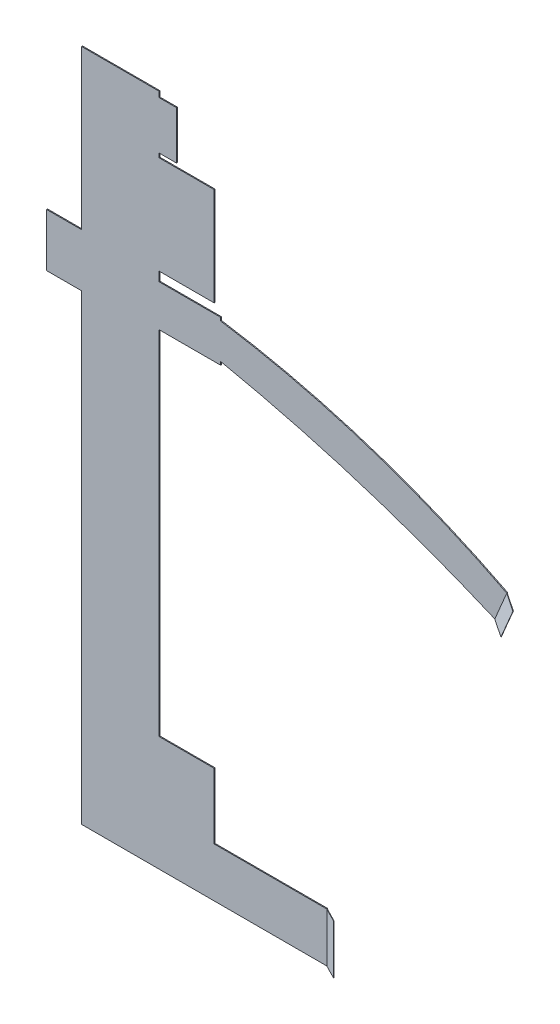
ISO-10303-21;
HEADER;
FILE_DESCRIPTION(('STEP AP214'),'2;1');
FILE_NAME('part.step','',(''),(''),'','','');
FILE_SCHEMA(('AUTOMOTIVE_DESIGN { 1 0 10303 214 1 1 1 1 }'));
ENDSEC;
DATA;
#1=APPLICATION_CONTEXT('core data for automotive mechanical design processes');
#2=APPLICATION_PROTOCOL_DEFINITION('international standard','automotive_design',2000,#1);
#3=PRODUCT_CONTEXT('',#1,'mechanical');
#4=PRODUCT('Part','Part','',(#3));
#5=PRODUCT_RELATED_PRODUCT_CATEGORY('part','',(#4));
#6=PRODUCT_DEFINITION_FORMATION('','',#4);
#7=PRODUCT_DEFINITION_CONTEXT('part definition',#1,'design');
#8=PRODUCT_DEFINITION('design','',#6,#7);
#9=PRODUCT_DEFINITION_SHAPE('','',#8);
#10=(LENGTH_UNIT() NAMED_UNIT(*) SI_UNIT(.MILLI.,.METRE.));
#11=(NAMED_UNIT(*) PLANE_ANGLE_UNIT() SI_UNIT($,.RADIAN.));
#12=(NAMED_UNIT(*) SI_UNIT($,.STERADIAN.) SOLID_ANGLE_UNIT());
#13=UNCERTAINTY_MEASURE_WITH_UNIT(LENGTH_MEASURE(1.E-05),#10,'distance_accuracy_value','');
#14=(GEOMETRIC_REPRESENTATION_CONTEXT(3) GLOBAL_UNCERTAINTY_ASSIGNED_CONTEXT((#13)) GLOBAL_UNIT_ASSIGNED_CONTEXT((#10,
#11,#12)) REPRESENTATION_CONTEXT('',''));
#15=CARTESIAN_POINT('',(0.,0.,0.));
#16=DIRECTION('',(0.,0.,1.));
#17=DIRECTION('',(1.,0.,0.));
#18=AXIS2_PLACEMENT_3D('',#15,#16,#17);
#19=CARTESIAN_POINT('',(-3.93603278625E-12,-673.599999999995,41.));
#20=DIRECTION('',(0.,-1.,0.));
#21=DIRECTION('',(1.,0.,0.));
#22=AXIS2_PLACEMENT_3D('',#19,#20,#21);
#23=PLANE('',#22);
#24=DIRECTION('',(1.,0.,0.));
#25=VECTOR('',#24,1.);
#26=CARTESIAN_POINT('',(-3.93603278625E-12,-673.599999999995,42.));
#27=LINE('',#26,#25);
#28=CARTESIAN_POINT('',(727.5,-673.599999999999,42.));
#29=VERTEX_POINT('',#28);
#30=CARTESIAN_POINT('',(765.5,-673.6,42.));
#31=VERTEX_POINT('',#30);
#32=EDGE_CURVE('E266',#29,#31,#27,.T.);
#33=ORIENTED_EDGE('',*,*,#32,.F.);
#34=DIRECTION('',(0.,0.,1.));
#35=VECTOR('',#34,1.);
#36=CARTESIAN_POINT('',(727.5,-673.599999999999,41.));
#37=LINE('',#36,#35);
#38=CARTESIAN_POINT('',(727.5,-673.599999999999,41.));
#39=VERTEX_POINT('',#38);
#40=EDGE_CURVE('E47',#39,#29,#37,.T.);
#41=ORIENTED_EDGE('',*,*,#40,.F.);
#42=DIRECTION('',(1.,0.,0.));
#43=VECTOR('',#42,1.);
#44=CARTESIAN_POINT('',(-3.93603278625E-12,-673.599999999995,41.));
#45=LINE('',#44,#43);
#46=CARTESIAN_POINT('',(765.5,-673.6,41.));
#47=VERTEX_POINT('',#46);
#48=EDGE_CURVE('E338',#39,#47,#45,.T.);
#49=ORIENTED_EDGE('',*,*,#48,.T.);
#50=DIRECTION('',(0.,0.,1.));
#51=VECTOR('',#50,1.);
#52=CARTESIAN_POINT('',(765.5,-673.6,41.));
#53=LINE('',#52,#51);
#54=EDGE_CURVE('E157',#47,#31,#53,.T.);
#55=ORIENTED_EDGE('',*,*,#54,.T.);
#56=EDGE_LOOP('',(#33,#41,#49,#55));
#57=FACE_BOUND('',#56,.T.);
#58=ADVANCED_FACE('F39',(#57),#23,.T.);
#59=CARTESIAN_POINT('',(727.500000000001,-1.40712064532198E-12,41.));
#60=DIRECTION('',(-1.,0.,0.));
#61=DIRECTION('',(0.,-1.,0.));
#62=AXIS2_PLACEMENT_3D('',#59,#60,#61);
#63=PLANE('',#62);
#64=DIRECTION('',(0.,-1.,0.));
#65=VECTOR('',#64,1.);
#66=CARTESIAN_POINT('',(727.500000000001,-1.40712064532198E-12,42.));
#67=LINE('',#66,#65);
#68=CARTESIAN_POINT('',(727.5,-616.2,42.));
#69=VERTEX_POINT('',#68);
#70=EDGE_CURVE('E335',#69,#29,#67,.T.);
#71=ORIENTED_EDGE('',*,*,#70,.F.);
#72=DIRECTION('',(0.,0.,1.));
#73=VECTOR('',#72,1.);
#74=CARTESIAN_POINT('',(727.5,-616.2,41.));
#75=LINE('',#74,#73);
#76=CARTESIAN_POINT('',(727.5,-616.2,41.));
#77=VERTEX_POINT('',#76);
#78=EDGE_CURVE('E255',#77,#69,#75,.T.);
#79=ORIENTED_EDGE('',*,*,#78,.F.);
#80=DIRECTION('',(0.,-1.,0.));
#81=VECTOR('',#80,1.);
#82=CARTESIAN_POINT('',(727.500000000001,-1.40712064532198E-12,41.));
#83=LINE('',#82,#81);
#84=EDGE_CURVE('E244',#77,#39,#83,.T.);
#85=ORIENTED_EDGE('',*,*,#84,.T.);
#86=ORIENTED_EDGE('',*,*,#40,.T.);
#87=EDGE_LOOP('',(#71,#79,#85,#86));
#88=FACE_BOUND('',#87,.T.);
#89=ADVANCED_FACE('F610',(#88),#63,.T.);
#90=CARTESIAN_POINT('',(-5.70099523145011E-12,-616.199999999993,41.));
#91=DIRECTION('',(0.,-1.,0.));
#92=DIRECTION('',(1.,0.,0.));
#93=AXIS2_PLACEMENT_3D('',#90,#91,#92);
#94=PLANE('',#93);
#95=DIRECTION('',(1.,0.,0.));
#96=VECTOR('',#95,1.);
#97=CARTESIAN_POINT('',(-5.70099523145011E-12,-616.199999999993,42.));
#98=LINE('',#97,#96);
#99=CARTESIAN_POINT('',(765.5,-616.2,42.));
#100=VERTEX_POINT('',#99);
#101=EDGE_CURVE('E251',#69,#100,#98,.T.);
#102=ORIENTED_EDGE('',*,*,#101,.T.);
#103=DIRECTION('',(0.,0.,1.));
#104=VECTOR('',#103,1.);
#105=CARTESIAN_POINT('',(765.5,-616.2,41.));
#106=LINE('',#105,#104);
#107=CARTESIAN_POINT('',(765.5,-616.2,41.));
#108=VERTEX_POINT('',#107);
#109=EDGE_CURVE('E248',#108,#100,#106,.T.);
#110=ORIENTED_EDGE('',*,*,#109,.F.);
#111=DIRECTION('',(1.,0.,0.));
#112=VECTOR('',#111,1.);
#113=CARTESIAN_POINT('',(-5.70099523145011E-12,-616.199999999993,41.));
#114=LINE('',#113,#112);
#115=EDGE_CURVE('E237',#77,#108,#114,.T.);
#116=ORIENTED_EDGE('',*,*,#115,.F.);
#117=ORIENTED_EDGE('',*,*,#78,.T.);
#118=EDGE_LOOP('',(#102,#110,#116,#117));
#119=FACE_BOUND('',#118,.T.);
#120=ADVANCED_FACE('F249',(#119),#94,.F.);
#121=CARTESIAN_POINT('',(765.500000000005,-6.82935850728131E-12,41.));
#122=DIRECTION('',(-1.,0.,0.));
#123=DIRECTION('',(0.,-1.,0.));
#124=AXIS2_PLACEMENT_3D('',#121,#122,#123);
#125=PLANE('',#124);
#126=DIRECTION('',(0.,-1.,0.));
#127=VECTOR('',#126,1.);
#128=CARTESIAN_POINT('',(765.500000000005,-6.82935850728131E-12,42.));
#129=LINE('',#128,#127);
#130=CARTESIAN_POINT('',(765.500000000001,-444.2,42.));
#131=VERTEX_POINT('',#130);
#132=EDGE_CURVE('E332',#131,#100,#129,.T.);
#133=ORIENTED_EDGE('',*,*,#132,.F.);
#134=DIRECTION('',(0.,0.,1.));
#135=VECTOR('',#134,1.);
#136=CARTESIAN_POINT('',(765.500000000001,-444.2,41.));
#137=LINE('',#136,#135);
#138=CARTESIAN_POINT('',(765.500000000001,-444.2,41.));
#139=VERTEX_POINT('',#138);
#140=EDGE_CURVE('E256',#139,#131,#137,.T.);
#141=ORIENTED_EDGE('',*,*,#140,.F.);
#142=DIRECTION('',(0.,-1.,0.));
#143=VECTOR('',#142,1.);
#144=CARTESIAN_POINT('',(765.500000000005,-6.82935850728131E-12,41.));
#145=LINE('',#144,#143);
#146=EDGE_CURVE('E242',#139,#108,#145,.T.);
#147=ORIENTED_EDGE('',*,*,#146,.T.);
#148=ORIENTED_EDGE('',*,*,#109,.T.);
#149=EDGE_LOOP('',(#133,#141,#147,#148));
#150=FACE_BOUND('',#149,.T.);
#151=ADVANCED_FACE('F258',(#150),#125,.T.);
#152=CARTESIAN_POINT('',(0.,-444.200000000001,41.));
#153=DIRECTION('',(0.,1.,0.));
#154=DIRECTION('',(0.,0.,1.));
#155=AXIS2_PLACEMENT_3D('',#152,#153,#154);
#156=PLANE('',#155);
#157=DIRECTION('',(-1.,0.,0.));
#158=VECTOR('',#157,1.);
#159=CARTESIAN_POINT('',(0.,-444.200000000001,42.));
#160=LINE('',#159,#158);
#161=CARTESIAN_POINT('',(849.200000000002,-444.200000000001,42.));
#162=VERTEX_POINT('',#161);
#163=EDGE_CURVE('E329',#162,#131,#160,.T.);
#164=ORIENTED_EDGE('',*,*,#163,.F.);
#165=DIRECTION('',(0.,0.,1.));
#166=VECTOR('',#165,1.);
#167=CARTESIAN_POINT('',(849.200000000002,-444.200000000001,41.));
#168=LINE('',#167,#166);
#169=CARTESIAN_POINT('',(849.200000000002,-444.200000000001,41.));
#170=VERTEX_POINT('',#169);
#171=EDGE_CURVE('E342',#170,#162,#168,.T.);
#172=ORIENTED_EDGE('',*,*,#171,.F.);
#173=DIRECTION('',(-1.,0.,0.));
#174=VECTOR('',#173,1.);
#175=CARTESIAN_POINT('',(0.,-444.200000000001,41.));
#176=LINE('',#175,#174);
#177=EDGE_CURVE('E259',#170,#139,#176,.T.);
#178=ORIENTED_EDGE('',*,*,#177,.T.);
#179=ORIENTED_EDGE('',*,*,#140,.T.);
#180=EDGE_LOOP('',(#164,#172,#178,#179));
#181=FACE_BOUND('',#180,.T.);
#182=ADVANCED_FACE('F619',(#181),#156,.T.);
#183=CARTESIAN_POINT('',(849.200000000002,0.,41.));
#184=DIRECTION('',(1.,0.,0.));
#185=DIRECTION('',(0.,0.,-1.));
#186=AXIS2_PLACEMENT_3D('',#183,#184,#185);
#187=PLANE('',#186);
#188=DIRECTION('',(0.,1.,0.));
#189=VECTOR('',#188,1.);
#190=CARTESIAN_POINT('',(849.200000000002,0.,42.));
#191=LINE('',#190,#189);
#192=CARTESIAN_POINT('',(849.200000000002,-450.200000000001,42.));
#193=VERTEX_POINT('',#192);
#194=EDGE_CURVE('E292',#193,#162,#191,.T.);
#195=ORIENTED_EDGE('',*,*,#194,.F.);
#196=DIRECTION('',(0.,0.,1.));
#197=VECTOR('',#196,1.);
#198=CARTESIAN_POINT('',(849.200000000002,-450.200000000001,41.));
#199=LINE('',#198,#197);
#200=CARTESIAN_POINT('',(849.200000000002,-450.200000000001,41.));
#201=VERTEX_POINT('',#200);
#202=EDGE_CURVE('E344',#201,#193,#199,.T.);
#203=ORIENTED_EDGE('',*,*,#202,.F.);
#204=DIRECTION('',(0.,1.,0.));
#205=VECTOR('',#204,1.);
#206=CARTESIAN_POINT('',(849.200000000002,0.,41.));
#207=LINE('',#206,#205);
#208=EDGE_CURVE('E261',#201,#170,#207,.T.);
#209=ORIENTED_EDGE('',*,*,#208,.T.);
#210=ORIENTED_EDGE('',*,*,#171,.T.);
#211=EDGE_LOOP('',(#195,#203,#209,#210));
#212=FACE_BOUND('',#211,.T.);
#213=ADVANCED_FACE('F644',(#212),#187,.T.);
#214=CARTESIAN_POINT('',(0.,-450.200000000001,41.));
#215=DIRECTION('',(0.,1.,0.));
#216=DIRECTION('',(0.,0.,1.));
#217=AXIS2_PLACEMENT_3D('',#214,#215,#216);
#218=PLANE('',#217);
#219=DIRECTION('',(-1.,0.,0.));
#220=VECTOR('',#219,1.);
#221=CARTESIAN_POINT('',(0.,-450.200000000001,42.));
#222=LINE('',#221,#220);
#223=CARTESIAN_POINT('',(868.200000000002,-450.200000000001,42.));
#224=VERTEX_POINT('',#223);
#225=EDGE_CURVE('E326',#224,#193,#222,.T.);
#226=ORIENTED_EDGE('',*,*,#225,.F.);
#227=DIRECTION('',(0.,0.,1.));
#228=VECTOR('',#227,1.);
#229=CARTESIAN_POINT('',(868.200000000002,-450.200000000001,41.));
#230=LINE('',#229,#228);
#231=CARTESIAN_POINT('',(868.200000000002,-450.200000000001,41.));
#232=VERTEX_POINT('',#231);
#233=EDGE_CURVE('E346',#232,#224,#230,.T.);
#234=ORIENTED_EDGE('',*,*,#233,.F.);
#235=DIRECTION('',(-1.,0.,0.));
#236=VECTOR('',#235,1.);
#237=CARTESIAN_POINT('',(0.,-450.200000000001,41.));
#238=LINE('',#237,#236);
#239=EDGE_CURVE('E480',#232,#201,#238,.T.);
#240=ORIENTED_EDGE('',*,*,#239,.T.);
#241=ORIENTED_EDGE('',*,*,#202,.T.);
#242=EDGE_LOOP('',(#226,#234,#240,#241));
#243=FACE_BOUND('',#242,.T.);
#244=ADVANCED_FACE('F654',(#243),#218,.T.);
#245=CARTESIAN_POINT('',(868.200000000002,0.,41.));
#246=DIRECTION('',(1.,0.,0.));
#247=DIRECTION('',(0.,0.,-1.));
#248=AXIS2_PLACEMENT_3D('',#245,#246,#247);
#249=PLANE('',#248);
#250=DIRECTION('',(0.,1.,0.));
#251=VECTOR('',#250,1.);
#252=CARTESIAN_POINT('',(868.200000000002,0.,42.));
#253=LINE('',#252,#251);
#254=CARTESIAN_POINT('',(868.200000000002,-502.200000000001,42.));
#255=VERTEX_POINT('',#254);
#256=EDGE_CURVE('E323',#255,#224,#253,.T.);
#257=ORIENTED_EDGE('',*,*,#256,.F.);
#258=DIRECTION('',(0.,0.,1.));
#259=VECTOR('',#258,1.);
#260=CARTESIAN_POINT('',(868.200000000002,-502.200000000001,41.));
#261=LINE('',#260,#259);
#262=CARTESIAN_POINT('',(868.200000000002,-502.200000000001,41.));
#263=VERTEX_POINT('',#262);
#264=EDGE_CURVE('E348',#263,#255,#261,.T.);
#265=ORIENTED_EDGE('',*,*,#264,.F.);
#266=DIRECTION('',(0.,1.,0.));
#267=VECTOR('',#266,1.);
#268=CARTESIAN_POINT('',(868.200000000002,0.,41.));
#269=LINE('',#268,#267);
#270=EDGE_CURVE('E478',#263,#232,#269,.T.);
#271=ORIENTED_EDGE('',*,*,#270,.T.);
#272=ORIENTED_EDGE('',*,*,#233,.T.);
#273=EDGE_LOOP('',(#257,#265,#271,#272));
#274=FACE_BOUND('',#273,.T.);
#275=ADVANCED_FACE('F624',(#274),#249,.T.);
#276=CARTESIAN_POINT('',(-5.86898950491309E-12,-502.199999999991,41.));
#277=DIRECTION('',(0.,-1.,0.));
#278=DIRECTION('',(1.,0.,0.));
#279=AXIS2_PLACEMENT_3D('',#276,#277,#278);
#280=PLANE('',#279);
#281=DIRECTION('',(1.,0.,0.));
#282=VECTOR('',#281,1.);
#283=CARTESIAN_POINT('',(-5.86898950491309E-12,-502.199999999991,42.));
#284=LINE('',#283,#282);
#285=CARTESIAN_POINT('',(849.200000000002,-502.200000000001,42.));
#286=VERTEX_POINT('',#285);
#287=EDGE_CURVE('E320',#286,#255,#284,.T.);
#288=ORIENTED_EDGE('',*,*,#287,.F.);
#289=DIRECTION('',(0.,0.,1.));
#290=VECTOR('',#289,1.);
#291=CARTESIAN_POINT('',(849.200000000002,-502.200000000001,41.));
#292=LINE('',#291,#290);
#293=CARTESIAN_POINT('',(849.200000000002,-502.200000000001,41.));
#294=VERTEX_POINT('',#293);
#295=EDGE_CURVE('E350',#294,#286,#292,.T.);
#296=ORIENTED_EDGE('',*,*,#295,.F.);
#297=DIRECTION('',(1.,0.,0.));
#298=VECTOR('',#297,1.);
#299=CARTESIAN_POINT('',(-5.86898950491309E-12,-502.199999999991,41.));
#300=LINE('',#299,#298);
#301=EDGE_CURVE('E475',#294,#263,#300,.T.);
#302=ORIENTED_EDGE('',*,*,#301,.T.);
#303=ORIENTED_EDGE('',*,*,#264,.T.);
#304=EDGE_LOOP('',(#288,#296,#302,#303));
#305=FACE_BOUND('',#304,.T.);
#306=ADVANCED_FACE('F628',(#305),#280,.T.);
#307=CARTESIAN_POINT('',(849.200000000002,-506.700000000001,42.));
#308=VERTEX_POINT('',#307);
#309=EDGE_CURVE('E319',#308,#286,#191,.T.);
#310=ORIENTED_EDGE('',*,*,#309,.F.);
#311=DIRECTION('',(0.,0.,1.));
#312=VECTOR('',#311,1.);
#313=CARTESIAN_POINT('',(849.200000000002,-506.700000000001,41.));
#314=LINE('',#313,#312);
#315=CARTESIAN_POINT('',(849.200000000002,-506.700000000001,41.));
#316=VERTEX_POINT('',#315);
#317=EDGE_CURVE('E352',#316,#308,#314,.T.);
#318=ORIENTED_EDGE('',*,*,#317,.F.);
#319=EDGE_CURVE('E474',#316,#294,#207,.T.);
#320=ORIENTED_EDGE('',*,*,#319,.T.);
#321=ORIENTED_EDGE('',*,*,#295,.T.);
#322=EDGE_LOOP('',(#310,#318,#320,#321));
#323=FACE_BOUND('',#322,.T.);
#324=ADVANCED_FACE('F641',(#323),#187,.T.);
#325=CARTESIAN_POINT('',(0.,-506.700000000001,41.));
#326=DIRECTION('',(0.,1.,0.));
#327=DIRECTION('',(0.,0.,1.));
#328=AXIS2_PLACEMENT_3D('',#325,#326,#327);
#329=PLANE('',#328);
#330=DIRECTION('',(-1.,0.,0.));
#331=VECTOR('',#330,1.);
#332=CARTESIAN_POINT('',(0.,-506.700000000001,42.));
#333=LINE('',#332,#331);
#334=CARTESIAN_POINT('',(909.200000000002,-506.700000000001,42.));
#335=VERTEX_POINT('',#334);
#336=EDGE_CURVE('E316',#335,#308,#333,.T.);
#337=ORIENTED_EDGE('',*,*,#336,.F.);
#338=DIRECTION('',(0.,0.,1.));
#339=VECTOR('',#338,1.);
#340=CARTESIAN_POINT('',(909.200000000002,-506.700000000001,41.));
#341=LINE('',#340,#339);
#342=CARTESIAN_POINT('',(909.200000000002,-506.700000000001,41.));
#343=VERTEX_POINT('',#342);
#344=EDGE_CURVE('E354',#343,#335,#341,.T.);
#345=ORIENTED_EDGE('',*,*,#344,.F.);
#346=DIRECTION('',(-1.,0.,0.));
#347=VECTOR('',#346,1.);
#348=CARTESIAN_POINT('',(0.,-506.700000000001,41.));
#349=LINE('',#348,#347);
#350=EDGE_CURVE('E471',#343,#316,#349,.T.);
#351=ORIENTED_EDGE('',*,*,#350,.T.);
#352=ORIENTED_EDGE('',*,*,#317,.T.);
#353=EDGE_LOOP('',(#337,#345,#351,#352));
#354=FACE_BOUND('',#353,.T.);
#355=ADVANCED_FACE('F633',(#354),#329,.T.);
#356=CARTESIAN_POINT('',(909.200000000009,-1.32817733419633E-11,41.));
#357=DIRECTION('',(1.,0.,0.));
#358=DIRECTION('',(0.,1.,0.));
#359=AXIS2_PLACEMENT_3D('',#356,#357,#358);
#360=PLANE('',#359);
#361=DIRECTION('',(0.,1.,0.));
#362=VECTOR('',#361,1.);
#363=CARTESIAN_POINT('',(909.200000000009,-1.32817733419633E-11,42.));
#364=LINE('',#363,#362);
#365=CARTESIAN_POINT('',(909.2,-613.1,42.));
#366=VERTEX_POINT('',#365);
#367=EDGE_CURVE('E313',#366,#335,#364,.T.);
#368=ORIENTED_EDGE('',*,*,#367,.F.);
#369=DIRECTION('',(0.,0.,1.));
#370=VECTOR('',#369,1.);
#371=CARTESIAN_POINT('',(909.2,-613.1,41.));
#372=LINE('',#371,#370);
#373=CARTESIAN_POINT('',(909.2,-613.1,41.));
#374=VERTEX_POINT('',#373);
#375=EDGE_CURVE('E356',#374,#366,#372,.T.);
#376=ORIENTED_EDGE('',*,*,#375,.F.);
#377=DIRECTION('',(0.,1.,0.));
#378=VECTOR('',#377,1.);
#379=CARTESIAN_POINT('',(909.200000000009,-1.32817733419633E-11,41.));
#380=LINE('',#379,#378);
#381=EDGE_CURVE('E468',#374,#343,#380,.T.);
#382=ORIENTED_EDGE('',*,*,#381,.T.);
#383=ORIENTED_EDGE('',*,*,#344,.T.);
#384=EDGE_LOOP('',(#368,#376,#382,#383));
#385=FACE_BOUND('',#384,.T.);
#386=ADVANCED_FACE('F637',(#385),#360,.T.);
#387=CARTESIAN_POINT('',(-9.07570315196916E-12,-613.099999999986,41.));
#388=DIRECTION('',(0.,-1.,0.));
#389=DIRECTION('',(1.,0.,0.));
#390=AXIS2_PLACEMENT_3D('',#387,#388,#389);
#391=PLANE('',#390);
#392=DIRECTION('',(1.,0.,0.));
#393=VECTOR('',#392,1.);
#394=CARTESIAN_POINT('',(-9.07570315196916E-12,-613.099999999986,42.));
#395=LINE('',#394,#393);
#396=CARTESIAN_POINT('',(849.200000000002,-613.099999999999,42.));
#397=VERTEX_POINT('',#396);
#398=EDGE_CURVE('E310',#397,#366,#395,.T.);
#399=ORIENTED_EDGE('',*,*,#398,.F.);
#400=DIRECTION('',(0.,0.,1.));
#401=VECTOR('',#400,1.);
#402=CARTESIAN_POINT('',(849.200000000002,-613.099999999999,41.));
#403=LINE('',#402,#401);
#404=CARTESIAN_POINT('',(849.200000000002,-613.099999999999,41.));
#405=VERTEX_POINT('',#404);
#406=EDGE_CURVE('E358',#405,#397,#403,.T.);
#407=ORIENTED_EDGE('',*,*,#406,.F.);
#408=DIRECTION('',(1.,0.,0.));
#409=VECTOR('',#408,1.);
#410=CARTESIAN_POINT('',(-9.07570315196916E-12,-613.099999999986,41.));
#411=LINE('',#410,#409);
#412=EDGE_CURVE('E465',#405,#374,#411,.T.);
#413=ORIENTED_EDGE('',*,*,#412,.T.);
#414=ORIENTED_EDGE('',*,*,#375,.T.);
#415=EDGE_LOOP('',(#399,#407,#413,#414));
#416=FACE_BOUND('',#415,.T.);
#417=ADVANCED_FACE('F639',(#416),#391,.T.);
#418=CARTESIAN_POINT('',(849.200000000002,-623.099999999999,42.));
#419=VERTEX_POINT('',#418);
#420=EDGE_CURVE('E293',#419,#397,#191,.T.);
#421=ORIENTED_EDGE('',*,*,#420,.F.);
#422=DIRECTION('',(0.,0.,1.));
#423=VECTOR('',#422,1.);
#424=CARTESIAN_POINT('',(849.200000000002,-623.099999999999,41.));
#425=LINE('',#424,#423);
#426=CARTESIAN_POINT('',(849.200000000002,-623.099999999999,41.));
#427=VERTEX_POINT('',#426);
#428=EDGE_CURVE('E360',#427,#419,#425,.T.);
#429=ORIENTED_EDGE('',*,*,#428,.F.);
#430=EDGE_CURVE('E445',#427,#405,#207,.T.);
#431=ORIENTED_EDGE('',*,*,#430,.T.);
#432=ORIENTED_EDGE('',*,*,#406,.T.);
#433=EDGE_LOOP('',(#421,#429,#431,#432));
#434=FACE_BOUND('',#433,.T.);
#435=ADVANCED_FACE('F494',(#434),#187,.T.);
#436=CARTESIAN_POINT('',(0.,-623.099999999999,41.));
#437=DIRECTION('',(0.,1.,0.));
#438=DIRECTION('',(0.,0.,1.));
#439=AXIS2_PLACEMENT_3D('',#436,#437,#438);
#440=PLANE('',#439);
#441=DIRECTION('',(-1.,0.,0.));
#442=VECTOR('',#441,1.);
#443=CARTESIAN_POINT('',(0.,-623.099999999999,42.));
#444=LINE('',#443,#442);
#445=CARTESIAN_POINT('',(916.200000000002,-623.099999999999,42.));
#446=VERTEX_POINT('',#445);
#447=EDGE_CURVE('E307',#446,#419,#444,.T.);
#448=ORIENTED_EDGE('',*,*,#447,.F.);
#449=DIRECTION('',(0.,0.,1.));
#450=VECTOR('',#449,1.);
#451=CARTESIAN_POINT('',(916.200000000002,-623.099999999999,41.));
#452=LINE('',#451,#450);
#453=CARTESIAN_POINT('',(916.200000000002,-623.099999999999,41.));
#454=VERTEX_POINT('',#453);
#455=EDGE_CURVE('E362',#454,#446,#452,.T.);
#456=ORIENTED_EDGE('',*,*,#455,.F.);
#457=DIRECTION('',(-1.,0.,0.));
#458=VECTOR('',#457,1.);
#459=CARTESIAN_POINT('',(0.,-623.099999999999,41.));
#460=LINE('',#459,#458);
#461=EDGE_CURVE('E462',#454,#427,#460,.T.);
#462=ORIENTED_EDGE('',*,*,#461,.T.);
#463=ORIENTED_EDGE('',*,*,#428,.T.);
#464=EDGE_LOOP('',(#448,#456,#462,#463));
#465=FACE_BOUND('',#464,.T.);
#466=ADVANCED_FACE('F502',(#465),#440,.T.);
#467=CARTESIAN_POINT('',(916.200000000002,0.,41.));
#468=DIRECTION('',(1.,0.,0.));
#469=DIRECTION('',(0.,0.,-1.));
#470=AXIS2_PLACEMENT_3D('',#467,#468,#469);
#471=PLANE('',#470);
#472=DIRECTION('',(0.,1.,0.));
#473=VECTOR('',#472,1.);
#474=CARTESIAN_POINT('',(916.200000000002,0.,42.));
#475=LINE('',#474,#473);
#476=CARTESIAN_POINT('',(916.200000000002,-626.599999999999,42.));
#477=VERTEX_POINT('',#476);
#478=EDGE_CURVE('E303',#477,#446,#475,.T.);
#479=ORIENTED_EDGE('',*,*,#478,.F.);
#480=DIRECTION('',(0.,0.,1.));
#481=VECTOR('',#480,1.);
#482=CARTESIAN_POINT('',(916.200000000002,-626.599999999999,41.));
#483=LINE('',#482,#481);
#484=CARTESIAN_POINT('',(916.200000000002,-626.599999999999,41.));
#485=VERTEX_POINT('',#484);
#486=EDGE_CURVE('E364',#485,#477,#483,.T.);
#487=ORIENTED_EDGE('',*,*,#486,.F.);
#488=DIRECTION('',(0.,1.,0.));
#489=VECTOR('',#488,1.);
#490=CARTESIAN_POINT('',(916.200000000002,0.,41.));
#491=LINE('',#490,#489);
#492=EDGE_CURVE('E459',#485,#454,#491,.T.);
#493=ORIENTED_EDGE('',*,*,#492,.T.);
#494=ORIENTED_EDGE('',*,*,#455,.T.);
#495=EDGE_LOOP('',(#479,#487,#493,#494));
#496=FACE_BOUND('',#495,.T.);
#497=ADVANCED_FACE('F505',(#496),#471,.T.);
#498=CARTESIAN_POINT('',(761.992951091582,-1632.44787421705,41.));
#499=DIRECTION('',(0.,0.,1.));
#500=DIRECTION('',(1.,0.,0.));
#501=AXIS2_PLACEMENT_3D('',#498,#499,#500);
#502=CYLINDRICAL_SURFACE('',#501,1017.6);
#503=CARTESIAN_POINT('',(761.992951091582,-1632.44787421705,42.));
#504=DIRECTION('',(0.,0.,1.));
#505=DIRECTION('',(1.,0.,0.));
#506=AXIS2_PLACEMENT_3D('',#503,#504,#505);
#507=CIRCLE('',#506,1017.6);
#508=CARTESIAN_POINT('',(1226.4,-726.999999999999,42.));
#509=VERTEX_POINT('',#508);
#510=EDGE_CURVE('E300',#509,#477,#507,.T.);
#511=ORIENTED_EDGE('',*,*,#510,.F.);
#512=DIRECTION('',(4.44089209850062E-13,-2.22044604925031E-13,1.));
#513=VECTOR('',#512,1.);
#514=CARTESIAN_POINT('',(1226.4,-726.999999999999,42.));
#515=LINE('',#514,#513);
#516=CARTESIAN_POINT('',(1226.4,-726.999999999999,41.5));
#517=VERTEX_POINT('',#516);
#518=EDGE_CURVE('E377',#517,#509,#515,.T.);
#519=ORIENTED_EDGE('',*,*,#518,.F.);
#520=DIRECTION('',(0.,0.,1.));
#521=VECTOR('',#520,1.);
#522=CARTESIAN_POINT('',(1226.4,-726.999999999999,41.));
#523=LINE('',#522,#521);
#524=CARTESIAN_POINT('',(1226.4,-726.999999999999,41.));
#525=VERTEX_POINT('',#524);
#526=EDGE_CURVE('E366',#525,#517,#523,.T.);
#527=ORIENTED_EDGE('',*,*,#526,.F.);
#528=CARTESIAN_POINT('',(761.992951091582,-1632.44787421705,41.));
#529=DIRECTION('',(0.,0.,1.));
#530=DIRECTION('',(1.,0.,0.));
#531=AXIS2_PLACEMENT_3D('',#528,#529,#530);
#532=CIRCLE('',#531,1017.6);
#533=EDGE_CURVE('E456',#525,#485,#532,.T.);
#534=ORIENTED_EDGE('',*,*,#533,.T.);
#535=ORIENTED_EDGE('',*,*,#486,.T.);
#536=EDGE_LOOP('',(#511,#519,#527,#534,#535));
#537=FACE_BOUND('',#536,.T.);
#538=ADVANCED_FACE('F509',(#537),#502,.T.);
#539=CARTESIAN_POINT('',(1300.97026154081,-550.899459284391,41.));
#540=DIRECTION('',(0.92084300964914,-0.38993352200127,0.));
#541=DIRECTION('',(0.38993352200127,0.92084300964914,0.));
#542=AXIS2_PLACEMENT_3D('',#539,#540,#541);
#543=PLANE('',#542);
#544=DIRECTION('',(0.389933522001264,0.920843009649142,0.));
#545=VECTOR('',#544,1.);
#546=CARTESIAN_POINT('',(1213.37622036516,-757.756156522281,41.5));
#547=LINE('',#546,#545);
#548=CARTESIAN_POINT('',(1213.4,-757.7,41.5));
#549=VERTEX_POINT('',#548);
#550=EDGE_CURVE('E11',#549,#517,#547,.T.);
#551=ORIENTED_EDGE('',*,*,#550,.F.);
#552=DIRECTION('',(0.,0.,1.));
#553=VECTOR('',#552,1.);
#554=CARTESIAN_POINT('',(1213.4,-757.7,41.));
#555=LINE('',#554,#553);
#556=CARTESIAN_POINT('',(1213.4,-757.7,41.));
#557=VERTEX_POINT('',#556);
#558=EDGE_CURVE('E369',#557,#549,#555,.T.);
#559=ORIENTED_EDGE('',*,*,#558,.F.);
#560=DIRECTION('',(0.38993352200127,0.92084300964914,0.));
#561=VECTOR('',#560,1.);
#562=CARTESIAN_POINT('',(1300.97026154081,-550.899459284391,41.));
#563=LINE('',#562,#561);
#564=EDGE_CURVE('E453',#557,#525,#563,.T.);
#565=ORIENTED_EDGE('',*,*,#564,.T.);
#566=ORIENTED_EDGE('',*,*,#526,.T.);
#567=EDGE_LOOP('',(#551,#559,#565,#566));
#568=FACE_BOUND('',#567,.T.);
#569=ADVANCED_FACE('F513',(#568),#543,.T.);
#570=CARTESIAN_POINT('',(605.600705159765,-2177.0364707467,41.));
#571=DIRECTION('',(0.,0.,1.));
#572=DIRECTION('',(1.,0.,0.));
#573=AXIS2_PLACEMENT_3D('',#570,#571,#572);
#574=CYLINDRICAL_SURFACE('',#573,1544.);
#575=CARTESIAN_POINT('',(605.600705159765,-2177.0364707467,42.));
#576=DIRECTION('',(0.,0.,1.));
#577=DIRECTION('',(1.,0.,0.));
#578=AXIS2_PLACEMENT_3D('',#575,#576,#577);
#579=CIRCLE('',#578,1544.);
#580=CARTESIAN_POINT('',(1213.4,-757.7,42.));
#581=VERTEX_POINT('',#580);
#582=CARTESIAN_POINT('',(916.200000000002,-664.599999999999,42.));
#583=VERTEX_POINT('',#582);
#584=EDGE_CURVE('E299',#581,#583,#579,.T.);
#585=ORIENTED_EDGE('',*,*,#584,.T.);
#586=DIRECTION('',(0.,0.,1.));
#587=VECTOR('',#586,1.);
#588=CARTESIAN_POINT('',(916.200000000002,-664.599999999999,41.));
#589=LINE('',#588,#587);
#590=CARTESIAN_POINT('',(916.200000000002,-664.599999999999,41.));
#591=VERTEX_POINT('',#590);
#592=EDGE_CURVE('E586',#591,#583,#589,.T.);
#593=ORIENTED_EDGE('',*,*,#592,.F.);
#594=CARTESIAN_POINT('',(605.600705159765,-2177.0364707467,41.));
#595=DIRECTION('',(0.,0.,1.));
#596=DIRECTION('',(1.,0.,0.));
#597=AXIS2_PLACEMENT_3D('',#594,#595,#596);
#598=CIRCLE('',#597,1544.);
#599=EDGE_CURVE('E451',#557,#591,#598,.T.);
#600=ORIENTED_EDGE('',*,*,#599,.F.);
#601=ORIENTED_EDGE('',*,*,#558,.T.);
#602=EDGE_CURVE('E584',#549,#581,#555,.T.);
#603=ORIENTED_EDGE('',*,*,#602,.T.);
#604=EDGE_LOOP('',(#585,#593,#600,#601,#603));
#605=FACE_BOUND('',#604,.T.);
#606=ADVANCED_FACE('F719',(#605),#574,.F.);
#607=CARTESIAN_POINT('',(916.200000000002,0.,41.));
#608=DIRECTION('',(1.,0.,0.));
#609=DIRECTION('',(0.,0.,-1.));
#610=AXIS2_PLACEMENT_3D('',#607,#608,#609);
#611=PLANE('',#610);
#612=DIRECTION('',(0.,1.,0.));
#613=VECTOR('',#612,1.);
#614=CARTESIAN_POINT('',(916.200000000002,0.,42.));
#615=LINE('',#614,#613);
#616=CARTESIAN_POINT('',(916.200000000002,-668.099999999999,42.));
#617=VERTEX_POINT('',#616);
#618=EDGE_CURVE('E296',#617,#583,#615,.T.);
#619=ORIENTED_EDGE('',*,*,#618,.F.);
#620=DIRECTION('',(0.,0.,1.));
#621=VECTOR('',#620,1.);
#622=CARTESIAN_POINT('',(916.200000000002,-668.099999999999,41.));
#623=LINE('',#622,#621);
#624=CARTESIAN_POINT('',(916.200000000002,-668.099999999999,41.));
#625=VERTEX_POINT('',#624);
#626=EDGE_CURVE('E687',#625,#617,#623,.T.);
#627=ORIENTED_EDGE('',*,*,#626,.F.);
#628=DIRECTION('',(0.,1.,0.));
#629=VECTOR('',#628,1.);
#630=CARTESIAN_POINT('',(916.200000000002,0.,41.));
#631=LINE('',#630,#629);
#632=EDGE_CURVE('E448',#625,#591,#631,.T.);
#633=ORIENTED_EDGE('',*,*,#632,.T.);
#634=ORIENTED_EDGE('',*,*,#592,.T.);
#635=EDGE_LOOP('',(#619,#627,#633,#634));
#636=FACE_BOUND('',#635,.T.);
#637=ADVANCED_FACE('F674',(#636),#611,.T.);
#638=CARTESIAN_POINT('',(0.,-668.099999999999,41.));
#639=DIRECTION('',(0.,-1.,0.));
#640=DIRECTION('',(0.,0.,-1.));
#641=AXIS2_PLACEMENT_3D('',#638,#639,#640);
#642=PLANE('',#641);
#643=DIRECTION('',(1.,0.,0.));
#644=VECTOR('',#643,1.);
#645=CARTESIAN_POINT('',(0.,-668.099999999999,42.));
#646=LINE('',#645,#644);
#647=CARTESIAN_POINT('',(849.200000000002,-668.099999999999,42.));
#648=VERTEX_POINT('',#647);
#649=EDGE_CURVE('E291',#648,#617,#646,.T.);
#650=ORIENTED_EDGE('',*,*,#649,.F.);
#651=DIRECTION('',(0.,0.,1.));
#652=VECTOR('',#651,1.);
#653=CARTESIAN_POINT('',(849.200000000002,-668.099999999999,41.));
#654=LINE('',#653,#652);
#655=CARTESIAN_POINT('',(849.200000000002,-668.099999999999,41.));
#656=VERTEX_POINT('',#655);
#657=EDGE_CURVE('E680',#656,#648,#654,.T.);
#658=ORIENTED_EDGE('',*,*,#657,.F.);
#659=DIRECTION('',(1.,0.,0.));
#660=VECTOR('',#659,1.);
#661=CARTESIAN_POINT('',(0.,-668.099999999999,41.));
#662=LINE('',#661,#660);
#663=EDGE_CURVE('E444',#656,#625,#662,.T.);
#664=ORIENTED_EDGE('',*,*,#663,.T.);
#665=ORIENTED_EDGE('',*,*,#626,.T.);
#666=EDGE_LOOP('',(#650,#658,#664,#665));
#667=FACE_BOUND('',#666,.T.);
#668=ADVANCED_FACE('F665',(#667),#642,.T.);
#669=CARTESIAN_POINT('',(849.200000000002,-1050.1,42.));
#670=VERTEX_POINT('',#669);
#671=EDGE_CURVE('E288',#670,#648,#191,.T.);
#672=ORIENTED_EDGE('',*,*,#671,.F.);
#673=DIRECTION('',(0.,0.,1.));
#674=VECTOR('',#673,1.);
#675=CARTESIAN_POINT('',(849.200000000002,-1050.1,41.));
#676=LINE('',#675,#674);
#677=CARTESIAN_POINT('',(849.200000000002,-1050.1,41.));
#678=VERTEX_POINT('',#677);
#679=EDGE_CURVE('E678',#678,#670,#676,.T.);
#680=ORIENTED_EDGE('',*,*,#679,.F.);
#681=EDGE_CURVE('E441',#678,#656,#207,.T.);
#682=ORIENTED_EDGE('',*,*,#681,.T.);
#683=ORIENTED_EDGE('',*,*,#657,.T.);
#684=EDGE_LOOP('',(#672,#680,#682,#683));
#685=FACE_BOUND('',#684,.T.);
#686=ADVANCED_FACE('F655',(#685),#187,.T.);
#687=CARTESIAN_POINT('',(0.,-1050.1,41.));
#688=DIRECTION('',(0.,1.,0.));
#689=DIRECTION('',(0.,0.,1.));
#690=AXIS2_PLACEMENT_3D('',#687,#688,#689);
#691=PLANE('',#690);
#692=DIRECTION('',(-1.,0.,0.));
#693=VECTOR('',#692,1.);
#694=CARTESIAN_POINT('',(0.,-1050.1,42.));
#695=LINE('',#694,#693);
#696=CARTESIAN_POINT('',(909.200000000002,-1050.1,42.));
#697=VERTEX_POINT('',#696);
#698=EDGE_CURVE('E285',#697,#670,#695,.T.);
#699=ORIENTED_EDGE('',*,*,#698,.F.);
#700=DIRECTION('',(0.,0.,1.));
#701=VECTOR('',#700,1.);
#702=CARTESIAN_POINT('',(909.200000000002,-1050.1,41.));
#703=LINE('',#702,#701);
#704=CARTESIAN_POINT('',(909.200000000002,-1050.1,41.));
#705=VERTEX_POINT('',#704);
#706=EDGE_CURVE('E684',#705,#697,#703,.T.);
#707=ORIENTED_EDGE('',*,*,#706,.F.);
#708=DIRECTION('',(-1.,0.,0.));
#709=VECTOR('',#708,1.);
#710=CARTESIAN_POINT('',(0.,-1050.1,41.));
#711=LINE('',#710,#709);
#712=EDGE_CURVE('E438',#705,#678,#711,.T.);
#713=ORIENTED_EDGE('',*,*,#712,.T.);
#714=ORIENTED_EDGE('',*,*,#679,.T.);
#715=EDGE_LOOP('',(#699,#707,#713,#714));
#716=FACE_BOUND('',#715,.T.);
#717=ADVANCED_FACE('F664',(#716),#691,.T.);
#718=CARTESIAN_POINT('',(909.200000000002,0.,41.));
#719=DIRECTION('',(1.,0.,0.));
#720=DIRECTION('',(0.,0.,-1.));
#721=AXIS2_PLACEMENT_3D('',#718,#719,#720);
#722=PLANE('',#721);
#723=DIRECTION('',(0.,1.,0.));
#724=VECTOR('',#723,1.);
#725=CARTESIAN_POINT('',(909.200000000002,0.,42.));
#726=LINE('',#725,#724);
#727=CARTESIAN_POINT('',(909.200000000002,-1121.1,42.));
#728=VERTEX_POINT('',#727);
#729=EDGE_CURVE('E282',#728,#697,#726,.T.);
#730=ORIENTED_EDGE('',*,*,#729,.F.);
#731=DIRECTION('',(0.,0.,1.));
#732=VECTOR('',#731,1.);
#733=CARTESIAN_POINT('',(909.200000000002,-1121.1,41.));
#734=LINE('',#733,#732);
#735=CARTESIAN_POINT('',(909.200000000002,-1121.1,41.));
#736=VERTEX_POINT('',#735);
#737=EDGE_CURVE('E689',#736,#728,#734,.T.);
#738=ORIENTED_EDGE('',*,*,#737,.F.);
#739=DIRECTION('',(0.,1.,0.));
#740=VECTOR('',#739,1.);
#741=CARTESIAN_POINT('',(909.200000000002,0.,41.));
#742=LINE('',#741,#740);
#743=EDGE_CURVE('E435',#736,#705,#742,.T.);
#744=ORIENTED_EDGE('',*,*,#743,.T.);
#745=ORIENTED_EDGE('',*,*,#706,.T.);
#746=EDGE_LOOP('',(#730,#738,#744,#745));
#747=FACE_BOUND('',#746,.T.);
#748=ADVANCED_FACE('F671',(#747),#722,.T.);
#749=CARTESIAN_POINT('',(0.,-1121.1,41.));
#750=DIRECTION('',(0.,1.,0.));
#751=DIRECTION('',(0.,0.,1.));
#752=AXIS2_PLACEMENT_3D('',#749,#750,#751);
#753=PLANE('',#752);
#754=DIRECTION('',(-1.,0.,0.));
#755=VECTOR('',#754,1.);
#756=CARTESIAN_POINT('',(0.,-1121.1,42.));
#757=LINE('',#756,#755);
#758=CARTESIAN_POINT('',(1031.2,-1121.1,42.));
#759=VERTEX_POINT('',#758);
#760=EDGE_CURVE('E279',#759,#728,#757,.T.);
#761=ORIENTED_EDGE('',*,*,#760,.F.);
#762=DIRECTION('',(-0.890868073580003,0.,-0.454262121991097));
#763=VECTOR('',#762,1.);
#764=CARTESIAN_POINT('',(1031.2,-1121.1,42.));
#765=LINE('',#764,#763);
#766=CARTESIAN_POINT('',(1046.2,-1121.1,49.6486429718872));
#767=VERTEX_POINT('',#766);
#768=EDGE_CURVE('E411',#767,#759,#765,.T.);
#769=ORIENTED_EDGE('',*,*,#768,.F.);
#770=DIRECTION('',(0.,0.,1.));
#771=VECTOR('',#770,1.);
#772=CARTESIAN_POINT('',(1046.2,-1121.1,49.6486429718872));
#773=LINE('',#772,#771);
#774=CARTESIAN_POINT('',(1046.2,-1121.1,49.1486429718872));
#775=VERTEX_POINT('',#774);
#776=EDGE_CURVE('E414',#775,#767,#773,.T.);
#777=ORIENTED_EDGE('',*,*,#776,.F.);
#778=DIRECTION('',(0.890868073580004,0.,0.454262121991096));
#779=VECTOR('',#778,1.);
#780=CARTESIAN_POINT('',(1046.2,-1121.1,49.1486429718872));
#781=LINE('',#780,#779);
#782=CARTESIAN_POINT('',(1031.2,-1121.1,41.5));
#783=VERTEX_POINT('',#782);
#784=EDGE_CURVE('E402',#783,#775,#781,.T.);
#785=ORIENTED_EDGE('',*,*,#784,.F.);
#786=DIRECTION('',(0.,0.,1.));
#787=VECTOR('',#786,1.);
#788=CARTESIAN_POINT('',(1031.2,-1121.1,41.));
#789=LINE('',#788,#787);
#790=CARTESIAN_POINT('',(1031.2,-1121.1,41.));
#791=VERTEX_POINT('',#790);
#792=EDGE_CURVE('E694',#791,#783,#789,.T.);
#793=ORIENTED_EDGE('',*,*,#792,.F.);
#794=DIRECTION('',(-1.,0.,0.));
#795=VECTOR('',#794,1.);
#796=CARTESIAN_POINT('',(0.,-1121.1,41.));
#797=LINE('',#796,#795);
#798=EDGE_CURVE('E432',#791,#736,#797,.T.);
#799=ORIENTED_EDGE('',*,*,#798,.T.);
#800=ORIENTED_EDGE('',*,*,#737,.T.);
#801=EDGE_LOOP('',(#761,#769,#777,#785,#793,#799,#800));
#802=FACE_BOUND('',#801,.T.);
#803=ADVANCED_FACE('F708',(#802),#753,.T.);
#804=CARTESIAN_POINT('',(1031.2,0.,41.));
#805=DIRECTION('',(1.,0.,0.));
#806=DIRECTION('',(0.,0.,-1.));
#807=AXIS2_PLACEMENT_3D('',#804,#805,#806);
#808=PLANE('',#807);
#809=DIRECTION('',(0.,-1.,0.));
#810=VECTOR('',#809,1.);
#811=CARTESIAN_POINT('',(1031.2,-1104.02954651208,41.5));
#812=LINE('',#811,#810);
#813=CARTESIAN_POINT('',(1031.2,-1174.6,41.5));
#814=VERTEX_POINT('',#813);
#815=EDGE_CURVE('E270',#783,#814,#812,.T.);
#816=ORIENTED_EDGE('',*,*,#815,.T.);
#817=DIRECTION('',(0.,0.,1.));
#818=VECTOR('',#817,1.);
#819=CARTESIAN_POINT('',(1031.2,-1174.6,41.));
#820=LINE('',#819,#818);
#821=CARTESIAN_POINT('',(1031.2,-1174.6,41.));
#822=VERTEX_POINT('',#821);
#823=EDGE_CURVE('E697',#822,#814,#820,.T.);
#824=ORIENTED_EDGE('',*,*,#823,.F.);
#825=DIRECTION('',(0.,1.,0.));
#826=VECTOR('',#825,1.);
#827=CARTESIAN_POINT('',(1031.2,0.,41.));
#828=LINE('',#827,#826);
#829=EDGE_CURVE('E429',#822,#791,#828,.T.);
#830=ORIENTED_EDGE('',*,*,#829,.T.);
#831=ORIENTED_EDGE('',*,*,#792,.T.);
#832=EDGE_LOOP('',(#816,#824,#830,#831));
#833=FACE_BOUND('',#832,.T.);
#834=ADVANCED_FACE('F734',(#833),#808,.T.);
#835=CARTESIAN_POINT('',(0.,-1174.6,41.));
#836=DIRECTION('',(0.,-1.,0.));
#837=DIRECTION('',(0.,0.,-1.));
#838=AXIS2_PLACEMENT_3D('',#835,#836,#837);
#839=PLANE('',#838);
#840=DIRECTION('',(1.,0.,0.));
#841=VECTOR('',#840,1.);
#842=CARTESIAN_POINT('',(0.,-1174.6,42.));
#843=LINE('',#842,#841);
#844=CARTESIAN_POINT('',(765.5,-1174.6,42.));
#845=VERTEX_POINT('',#844);
#846=CARTESIAN_POINT('',(1031.2,-1174.6,42.));
#847=VERTEX_POINT('',#846);
#848=EDGE_CURVE('E273',#845,#847,#843,.T.);
#849=ORIENTED_EDGE('',*,*,#848,.F.);
#850=DIRECTION('',(0.,0.,1.));
#851=VECTOR('',#850,1.);
#852=CARTESIAN_POINT('',(765.5,-1174.6,41.));
#853=LINE('',#852,#851);
#854=CARTESIAN_POINT('',(765.5,-1174.6,41.));
#855=VERTEX_POINT('',#854);
#856=EDGE_CURVE('E699',#855,#845,#853,.T.);
#857=ORIENTED_EDGE('',*,*,#856,.F.);
#858=DIRECTION('',(1.,0.,0.));
#859=VECTOR('',#858,1.);
#860=CARTESIAN_POINT('',(0.,-1174.6,41.));
#861=LINE('',#860,#859);
#862=EDGE_CURVE('E426',#855,#822,#861,.T.);
#863=ORIENTED_EDGE('',*,*,#862,.T.);
#864=ORIENTED_EDGE('',*,*,#823,.T.);
#865=DIRECTION('',(0.890868073580003,0.,0.454262121991096));
#866=VECTOR('',#865,1.);
#867=CARTESIAN_POINT('',(1046.2,-1174.6,49.1486429718872));
#868=LINE('',#867,#866);
#869=CARTESIAN_POINT('',(1046.2,-1174.6,49.1486429718872));
#870=VERTEX_POINT('',#869);
#871=EDGE_CURVE('E384',#814,#870,#868,.T.);
#872=ORIENTED_EDGE('',*,*,#871,.T.);
#873=DIRECTION('',(0.,0.,1.));
#874=VECTOR('',#873,1.);
#875=CARTESIAN_POINT('',(1046.2,-1174.6,49.6486429718872));
#876=LINE('',#875,#874);
#877=CARTESIAN_POINT('',(1046.2,-1174.6,49.6486429718872));
#878=VERTEX_POINT('',#877);
#879=EDGE_CURVE('E403',#870,#878,#876,.T.);
#880=ORIENTED_EDGE('',*,*,#879,.T.);
#881=DIRECTION('',(-0.890868073580003,0.,-0.454262121991097));
#882=VECTOR('',#881,1.);
#883=CARTESIAN_POINT('',(1031.2,-1174.6,42.));
#884=LINE('',#883,#882);
#885=EDGE_CURVE('E399',#878,#847,#884,.T.);
#886=ORIENTED_EDGE('',*,*,#885,.T.);
#887=EDGE_LOOP('',(#849,#857,#863,#864,#872,#880,#886));
#888=FACE_BOUND('',#887,.T.);
#889=ADVANCED_FACE('F704',(#888),#839,.T.);
#890=CARTESIAN_POINT('',(765.5,0.,41.));
#891=DIRECTION('',(-1.,0.,0.));
#892=DIRECTION('',(0.,0.,1.));
#893=AXIS2_PLACEMENT_3D('',#890,#891,#892);
#894=PLANE('',#893);
#895=DIRECTION('',(0.,-1.,0.));
#896=VECTOR('',#895,1.);
#897=CARTESIAN_POINT('',(765.5,0.,42.));
#898=LINE('',#897,#896);
#899=EDGE_CURVE('E269',#31,#845,#898,.T.);
#900=ORIENTED_EDGE('',*,*,#899,.F.);
#901=ORIENTED_EDGE('',*,*,#54,.F.);
#902=DIRECTION('',(0.,-1.,0.));
#903=VECTOR('',#902,1.);
#904=CARTESIAN_POINT('',(765.5,0.,41.));
#905=LINE('',#904,#903);
#906=EDGE_CURVE('E424',#47,#855,#905,.T.);
#907=ORIENTED_EDGE('',*,*,#906,.T.);
#908=ORIENTED_EDGE('',*,*,#856,.T.);
#909=EDGE_LOOP('',(#900,#901,#907,#908));
#910=FACE_BOUND('',#909,.T.);
#911=ADVANCED_FACE('F701',(#910),#894,.T.);
#912=CARTESIAN_POINT('',(0.,0.,41.));
#913=DIRECTION('',(0.,0.,1.));
#914=DIRECTION('',(1.,0.,0.));
#915=AXIS2_PLACEMENT_3D('',#912,#913,#914);
#916=PLANE('',#915);
#917=ORIENTED_EDGE('',*,*,#48,.F.);
#918=ORIENTED_EDGE('',*,*,#84,.F.);
#919=ORIENTED_EDGE('',*,*,#115,.T.);
#920=ORIENTED_EDGE('',*,*,#146,.F.);
#921=ORIENTED_EDGE('',*,*,#177,.F.);
#922=ORIENTED_EDGE('',*,*,#208,.F.);
#923=ORIENTED_EDGE('',*,*,#239,.F.);
#924=ORIENTED_EDGE('',*,*,#270,.F.);
#925=ORIENTED_EDGE('',*,*,#301,.F.);
#926=ORIENTED_EDGE('',*,*,#319,.F.);
#927=ORIENTED_EDGE('',*,*,#350,.F.);
#928=ORIENTED_EDGE('',*,*,#381,.F.);
#929=ORIENTED_EDGE('',*,*,#412,.F.);
#930=ORIENTED_EDGE('',*,*,#430,.F.);
#931=ORIENTED_EDGE('',*,*,#461,.F.);
#932=ORIENTED_EDGE('',*,*,#492,.F.);
#933=ORIENTED_EDGE('',*,*,#533,.F.);
#934=ORIENTED_EDGE('',*,*,#564,.F.);
#935=ORIENTED_EDGE('',*,*,#599,.T.);
#936=ORIENTED_EDGE('',*,*,#632,.F.);
#937=ORIENTED_EDGE('',*,*,#663,.F.);
#938=ORIENTED_EDGE('',*,*,#681,.F.);
#939=ORIENTED_EDGE('',*,*,#712,.F.);
#940=ORIENTED_EDGE('',*,*,#743,.F.);
#941=ORIENTED_EDGE('',*,*,#798,.F.);
#942=ORIENTED_EDGE('',*,*,#829,.F.);
#943=ORIENTED_EDGE('',*,*,#862,.F.);
#944=ORIENTED_EDGE('',*,*,#906,.F.);
#945=EDGE_LOOP('',(#917,#918,#919,#920,#921,#922,#923,#924,#925,#926,#927,#928,#929,#930,#931,
#932,#933,#934,#935,#936,#937,#938,#939,#940,#941,#942,#943,#944));
#946=FACE_BOUND('',#945,.T.);
#947=ADVANCED_FACE('F239',(#946),#916,.F.);
#948=CARTESIAN_POINT('',(0.,0.,42.));
#949=DIRECTION('',(0.,0.,1.));
#950=DIRECTION('',(1.,0.,0.));
#951=AXIS2_PLACEMENT_3D('',#948,#949,#950);
#952=PLANE('',#951);
#953=ORIENTED_EDGE('',*,*,#32,.T.);
#954=ORIENTED_EDGE('',*,*,#899,.T.);
#955=ORIENTED_EDGE('',*,*,#848,.T.);
#956=DIRECTION('',(0.,1.,0.));
#957=VECTOR('',#956,1.);
#958=CARTESIAN_POINT('',(1031.2,0.,42.));
#959=LINE('',#958,#957);
#960=EDGE_CURVE('E276',#847,#759,#959,.T.);
#961=ORIENTED_EDGE('',*,*,#960,.T.);
#962=ORIENTED_EDGE('',*,*,#760,.T.);
#963=ORIENTED_EDGE('',*,*,#729,.T.);
#964=ORIENTED_EDGE('',*,*,#698,.T.);
#965=ORIENTED_EDGE('',*,*,#671,.T.);
#966=ORIENTED_EDGE('',*,*,#649,.T.);
#967=ORIENTED_EDGE('',*,*,#618,.T.);
#968=ORIENTED_EDGE('',*,*,#584,.F.);
#969=DIRECTION('',(0.38993352200127,0.92084300964914,0.));
#970=VECTOR('',#969,1.);
#971=CARTESIAN_POINT('',(1300.97026154081,-550.899459284391,42.));
#972=LINE('',#971,#970);
#973=EDGE_CURVE('E304',#581,#509,#972,.T.);
#974=ORIENTED_EDGE('',*,*,#973,.T.);
#975=ORIENTED_EDGE('',*,*,#510,.T.);
#976=ORIENTED_EDGE('',*,*,#478,.T.);
#977=ORIENTED_EDGE('',*,*,#447,.T.);
#978=ORIENTED_EDGE('',*,*,#420,.T.);
#979=ORIENTED_EDGE('',*,*,#398,.T.);
#980=ORIENTED_EDGE('',*,*,#367,.T.);
#981=ORIENTED_EDGE('',*,*,#336,.T.);
#982=ORIENTED_EDGE('',*,*,#309,.T.);
#983=ORIENTED_EDGE('',*,*,#287,.T.);
#984=ORIENTED_EDGE('',*,*,#256,.T.);
#985=ORIENTED_EDGE('',*,*,#225,.T.);
#986=ORIENTED_EDGE('',*,*,#194,.T.);
#987=ORIENTED_EDGE('',*,*,#163,.T.);
#988=ORIENTED_EDGE('',*,*,#132,.T.);
#989=ORIENTED_EDGE('',*,*,#101,.F.);
#990=ORIENTED_EDGE('',*,*,#70,.T.);
#991=EDGE_LOOP('',(#953,#954,#955,#961,#962,#963,#964,#965,#966,#967,#968,#974,#975,#976,#977,
#978,#979,#980,#981,#982,#983,#984,#985,#986,#987,#988,#989,#990));
#992=FACE_BOUND('',#991,.T.);
#993=ADVANCED_FACE('F593',(#992),#952,.T.);
#994=CARTESIAN_POINT('',(1046.2,-1104.02954651208,49.1486429718872));
#995=DIRECTION('',(0.454262121991096,0.,-0.890868073580004));
#996=DIRECTION('',(-0.890868073580004,0.,-0.454262121991096));
#997=AXIS2_PLACEMENT_3D('',#994,#995,#996);
#998=PLANE('',#997);
#999=ORIENTED_EDGE('',*,*,#815,.F.);
#1000=ORIENTED_EDGE('',*,*,#784,.T.);
#1001=DIRECTION('',(0.,-1.,0.));
#1002=VECTOR('',#1001,1.);
#1003=CARTESIAN_POINT('',(1046.2,-1104.02954651208,49.1486429718872));
#1004=LINE('',#1003,#1002);
#1005=EDGE_CURVE('E410',#775,#870,#1004,.T.);
#1006=ORIENTED_EDGE('',*,*,#1005,.T.);
#1007=ORIENTED_EDGE('',*,*,#871,.F.);
#1008=EDGE_LOOP('',(#999,#1000,#1006,#1007));
#1009=FACE_BOUND('',#1008,.T.);
#1010=ADVANCED_FACE('F747',(#1009),#998,.T.);
#1011=CARTESIAN_POINT('',(1046.2,-1104.02954651208,49.6486429718872));
#1012=DIRECTION('',(1.,0.,0.));
#1013=DIRECTION('',(0.,0.,-1.));
#1014=AXIS2_PLACEMENT_3D('',#1011,#1012,#1013);
#1015=PLANE('',#1014);
#1016=ORIENTED_EDGE('',*,*,#1005,.F.);
#1017=ORIENTED_EDGE('',*,*,#776,.T.);
#1018=DIRECTION('',(0.,-1.,0.));
#1019=VECTOR('',#1018,1.);
#1020=CARTESIAN_POINT('',(1046.2,-1104.02954651208,49.6486429718872));
#1021=LINE('',#1020,#1019);
#1022=EDGE_CURVE('E413',#767,#878,#1021,.T.);
#1023=ORIENTED_EDGE('',*,*,#1022,.T.);
#1024=ORIENTED_EDGE('',*,*,#879,.F.);
#1025=EDGE_LOOP('',(#1016,#1017,#1023,#1024));
#1026=FACE_BOUND('',#1025,.T.);
#1027=ADVANCED_FACE('F903',(#1026),#1015,.T.);
#1028=CARTESIAN_POINT('',(1031.2,-1104.02954651208,42.));
#1029=DIRECTION('',(-0.454262121991097,0.,0.890868073580003));
#1030=DIRECTION('',(0.890868073580003,0.,0.454262121991097));
#1031=AXIS2_PLACEMENT_3D('',#1028,#1029,#1030);
#1032=PLANE('',#1031);
#1033=ORIENTED_EDGE('',*,*,#1022,.F.);
#1034=ORIENTED_EDGE('',*,*,#768,.T.);
#1035=ORIENTED_EDGE('',*,*,#960,.F.);
#1036=ORIENTED_EDGE('',*,*,#885,.F.);
#1037=EDGE_LOOP('',(#1033,#1034,#1035,#1036));
#1038=FACE_BOUND('',#1037,.T.);
#1039=ADVANCED_FACE('F707',(#1038),#1032,.T.);
#1040=CARTESIAN_POINT('',(1213.37622036516,-757.756156522281,42.));
#1041=DIRECTION('',(-0.920843009649142,0.389933522001264,4.95519079390837E-13));
#1042=DIRECTION('',(-0.389933522001264,-0.920843009649142,0.));
#1043=AXIS2_PLACEMENT_3D('',#1040,#1041,#1042);
#1044=PLANE('',#1043);
#1045=ORIENTED_EDGE('',*,*,#602,.F.);
#1046=CARTESIAN_POINT('',(1213.37622036516,-757.756156522281,41.5));
#1047=VERTEX_POINT('',#1046);
#1048=EDGE_CURVE('E379',#1047,#549,#547,.T.);
#1049=ORIENTED_EDGE('',*,*,#1048,.F.);
#1050=DIRECTION('',(4.44089209850062E-13,-2.22044604925031E-13,1.));
#1051=VECTOR('',#1050,1.);
#1052=CARTESIAN_POINT('',(1213.37622036516,-757.756156522281,42.));
#1053=LINE('',#1052,#1051);
#1054=CARTESIAN_POINT('',(1213.37622036516,-757.756156522281,42.));
#1055=VERTEX_POINT('',#1054);
#1056=EDGE_CURVE('E578',#1047,#1055,#1053,.T.);
#1057=ORIENTED_EDGE('',*,*,#1056,.T.);
#1058=DIRECTION('',(0.389933522001264,0.920843009649142,0.));
#1059=VECTOR('',#1058,1.);
#1060=CARTESIAN_POINT('',(1213.37622036516,-757.756156522281,42.));
#1061=LINE('',#1060,#1059);
#1062=EDGE_CURVE('E393',#1055,#581,#1061,.T.);
#1063=ORIENTED_EDGE('',*,*,#1062,.T.);
#1064=EDGE_LOOP('',(#1045,#1049,#1057,#1063));
#1065=FACE_BOUND('',#1064,.T.);
#1066=ADVANCED_FACE('F594',(#1065),#1044,.T.);
#1067=CARTESIAN_POINT('',(1213.37622036516,-757.756156522281,41.5));
#1068=DIRECTION('',(0.407546080002545,-0.172576515961989,-0.896729356502273));
#1069=DIRECTION('',(-0.910388724426035,0.,-0.41375399748877));
#1070=AXIS2_PLACEMENT_3D('',#1067,#1068,#1069);
#1071=PLANE('',#1070);
#1072=DIRECTION('',(-0.82574695948229,0.349664836262861,-0.44257932756402));
#1073=VECTOR('',#1072,1.);
#1074=CARTESIAN_POINT('',(1226.4,-726.999999999999,41.5));
#1075=LINE('',#1074,#1073);
#1076=CARTESIAN_POINT('',(1240.67306664956,-733.043969591019,49.15));
#1077=VERTEX_POINT('',#1076);
#1078=EDGE_CURVE('E570',#1077,#517,#1075,.T.);
#1079=ORIENTED_EDGE('',*,*,#1078,.F.);
#1080=DIRECTION('',(0.389933522001264,0.920843009649142,0.));
#1081=VECTOR('',#1080,1.);
#1082=CARTESIAN_POINT('',(1227.64928701472,-763.8001261133,49.15));
#1083=LINE('',#1082,#1081);
#1084=CARTESIAN_POINT('',(1227.64928701472,-763.8001261133,49.15));
#1085=VERTEX_POINT('',#1084);
#1086=EDGE_CURVE('E385',#1085,#1077,#1083,.T.);
#1087=ORIENTED_EDGE('',*,*,#1086,.F.);
#1088=DIRECTION('',(-0.82574695948229,0.349664836262861,-0.44257932756402));
#1089=VECTOR('',#1088,1.);
#1090=CARTESIAN_POINT('',(1213.37622036516,-757.756156522281,41.5));
#1091=LINE('',#1090,#1089);
#1092=EDGE_CURVE('E398',#1085,#1047,#1091,.T.);
#1093=ORIENTED_EDGE('',*,*,#1092,.T.);
#1094=ORIENTED_EDGE('',*,*,#1048,.T.);
#1095=ORIENTED_EDGE('',*,*,#550,.T.);
#1096=EDGE_LOOP('',(#1079,#1087,#1093,#1094,#1095));
#1097=FACE_BOUND('',#1096,.T.);
#1098=ADVANCED_FACE('F597',(#1097),#1071,.T.);
#1099=CARTESIAN_POINT('',(1227.64928701472,-763.8001261133,49.15));
#1100=DIRECTION('',(0.920843009649142,-0.389933522001264,0.));
#1101=DIRECTION('',(0.389933522001264,0.920843009649142,0.));
#1102=AXIS2_PLACEMENT_3D('',#1099,#1100,#1101);
#1103=PLANE('',#1102);
#1104=DIRECTION('',(0.,0.,-1.));
#1105=VECTOR('',#1104,1.);
#1106=CARTESIAN_POINT('',(1240.67306664956,-733.043969591019,49.15));
#1107=LINE('',#1106,#1105);
#1108=CARTESIAN_POINT('',(1240.67306664956,-733.043969591019,49.6499999999999));
#1109=VERTEX_POINT('',#1108);
#1110=EDGE_CURVE('E386',#1109,#1077,#1107,.T.);
#1111=ORIENTED_EDGE('',*,*,#1110,.F.);
#1112=DIRECTION('',(0.389933522001264,0.920843009649142,0.));
#1113=VECTOR('',#1112,1.);
#1114=CARTESIAN_POINT('',(1227.64928701472,-763.8001261133,49.6499999999999));
#1115=LINE('',#1114,#1113);
#1116=CARTESIAN_POINT('',(1227.64928701472,-763.8001261133,49.6499999999999));
#1117=VERTEX_POINT('',#1116);
#1118=EDGE_CURVE('E390',#1117,#1109,#1115,.T.);
#1119=ORIENTED_EDGE('',*,*,#1118,.F.);
#1120=DIRECTION('',(0.,0.,-1.));
#1121=VECTOR('',#1120,1.);
#1122=CARTESIAN_POINT('',(1227.64928701472,-763.8001261133,49.15));
#1123=LINE('',#1122,#1121);
#1124=EDGE_CURVE('E575',#1117,#1085,#1123,.T.);
#1125=ORIENTED_EDGE('',*,*,#1124,.T.);
#1126=ORIENTED_EDGE('',*,*,#1086,.T.);
#1127=EDGE_LOOP('',(#1111,#1119,#1125,#1126));
#1128=FACE_BOUND('',#1127,.T.);
#1129=ADVANCED_FACE('F566',(#1128),#1103,.T.);
#1130=CARTESIAN_POINT('',(1227.64928701472,-763.8001261133,49.6499999999999));
#1131=DIRECTION('',(-0.407546080002546,0.172576515961989,0.896729356502272));
#1132=DIRECTION('',(0.910388724426034,0.,0.413753997488771));
#1133=AXIS2_PLACEMENT_3D('',#1130,#1131,#1132);
#1134=PLANE('',#1133);
#1135=DIRECTION('',(0.82574695948229,-0.34966483626286,0.44257932756402));
#1136=VECTOR('',#1135,1.);
#1137=CARTESIAN_POINT('',(1240.67306664956,-733.043969591019,49.6499999999999));
#1138=LINE('',#1137,#1136);
#1139=EDGE_CURVE('E559',#509,#1109,#1138,.T.);
#1140=ORIENTED_EDGE('',*,*,#1139,.F.);
#1141=ORIENTED_EDGE('',*,*,#973,.F.);
#1142=ORIENTED_EDGE('',*,*,#1062,.F.);
#1143=DIRECTION('',(0.82574695948229,-0.34966483626286,0.44257932756402));
#1144=VECTOR('',#1143,1.);
#1145=CARTESIAN_POINT('',(1227.64928701472,-763.8001261133,49.6499999999999));
#1146=LINE('',#1145,#1144);
#1147=EDGE_CURVE('E561',#1055,#1117,#1146,.T.);
#1148=ORIENTED_EDGE('',*,*,#1147,.T.);
#1149=ORIENTED_EDGE('',*,*,#1118,.T.);
#1150=EDGE_LOOP('',(#1140,#1141,#1142,#1148,#1149));
#1151=FACE_BOUND('',#1150,.T.);
#1152=ADVANCED_FACE('F556',(#1151),#1134,.T.);
#1153=CARTESIAN_POINT('',(-87.5940411756607,-206.856697237913,-5.98632646431221E-12));
#1154=DIRECTION('',(-0.389933522001253,-0.920843009649147,0.));
#1155=DIRECTION('',(0.920843009649147,-0.389933522001253,0.));
#1156=AXIS2_PLACEMENT_3D('',#1153,#1154,#1155);
#1157=PLANE('',#1156);
#1158=ORIENTED_EDGE('',*,*,#1056,.F.);
#1159=ORIENTED_EDGE('',*,*,#1092,.F.);
#1160=ORIENTED_EDGE('',*,*,#1124,.F.);
#1161=ORIENTED_EDGE('',*,*,#1147,.F.);
#1162=EDGE_LOOP('',(#1158,#1159,#1160,#1161));
#1163=FACE_BOUND('',#1162,.T.);
#1164=ADVANCED_FACE('F600',(#1163),#1157,.T.);
#1165=CARTESIAN_POINT('',(-74.5702615408185,-176.100540715632,-5.98632646431221E-12));
#1166=DIRECTION('',(-0.389933522001253,-0.920843009649147,0.));
#1167=DIRECTION('',(0.920843009649147,-0.389933522001253,0.));
#1168=AXIS2_PLACEMENT_3D('',#1165,#1166,#1167);
#1169=PLANE('',#1168);
#1170=ORIENTED_EDGE('',*,*,#518,.T.);
#1171=ORIENTED_EDGE('',*,*,#1139,.T.);
#1172=ORIENTED_EDGE('',*,*,#1110,.T.);
#1173=ORIENTED_EDGE('',*,*,#1078,.T.);
#1174=EDGE_LOOP('',(#1170,#1171,#1172,#1173));
#1175=FACE_BOUND('',#1174,.T.);
#1176=ADVANCED_FACE('F571',(#1175),#1169,.F.);
#1177=CLOSED_SHELL('',(#58,#89,#120,#151,#182,#213,#244,#275,#306,#324,#355,#386,#417,#435,#466,
#497,#538,#569,#606,#637,#668,#686,#717,#748,#803,#834,#889,#911,#947,#993,#1010,#1027,#1039,
#1066,#1098,#1129,#1152,#1164,#1176));
#1178=MANIFOLD_SOLID_BREP('B2',#1177);
#1179=ADVANCED_BREP_SHAPE_REPRESENTATION('',(#18,#1178),#14);
#1180=SHAPE_DEFINITION_REPRESENTATION(#9,#1179);
ENDSEC;
END-ISO-10303-21;
